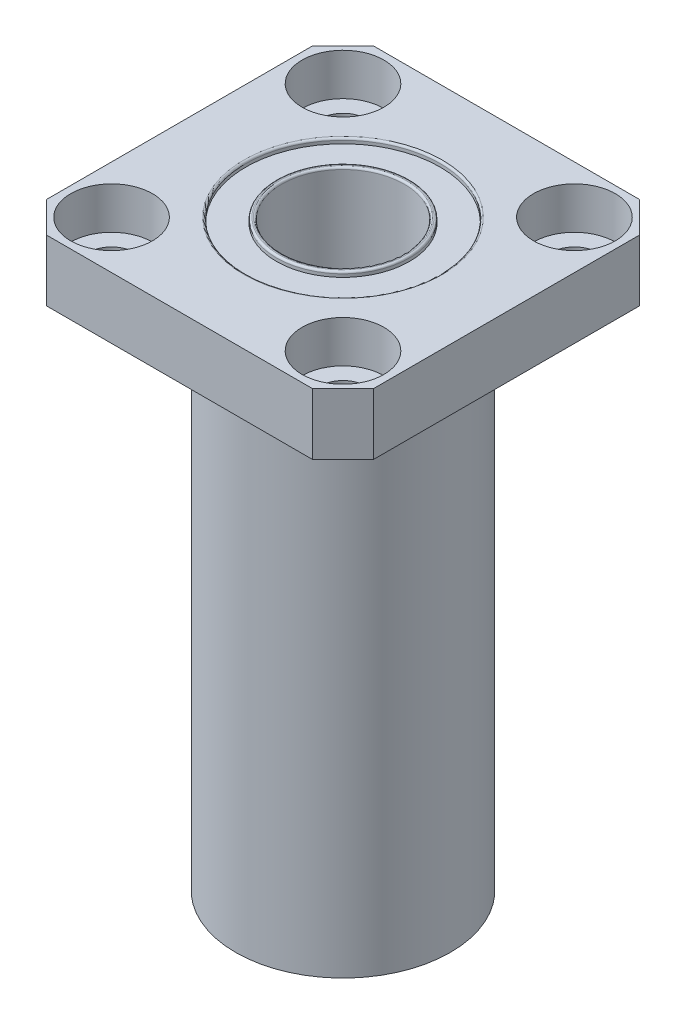
ISO-10303-21;
HEADER;
FILE_DESCRIPTION(('STEP AP214'),'2;1');
FILE_NAME('part.step','',(''),(''),'','','');
FILE_SCHEMA(('AUTOMOTIVE_DESIGN { 1 0 10303 214 1 1 1 1 }'));
ENDSEC;
DATA;
#1=APPLICATION_CONTEXT('core data for automotive mechanical design processes');
#2=APPLICATION_PROTOCOL_DEFINITION('international standard','automotive_design',2000,#1);
#3=PRODUCT_CONTEXT('',#1,'mechanical');
#4=PRODUCT('Part','Part','',(#3));
#5=PRODUCT_RELATED_PRODUCT_CATEGORY('part','',(#4));
#6=PRODUCT_DEFINITION_FORMATION('','',#4);
#7=PRODUCT_DEFINITION_CONTEXT('part definition',#1,'design');
#8=PRODUCT_DEFINITION('design','',#6,#7);
#9=PRODUCT_DEFINITION_SHAPE('','',#8);
#10=(LENGTH_UNIT() NAMED_UNIT(*) SI_UNIT(.MILLI.,.METRE.));
#11=(NAMED_UNIT(*) PLANE_ANGLE_UNIT() SI_UNIT($,.RADIAN.));
#12=(NAMED_UNIT(*) SI_UNIT($,.STERADIAN.) SOLID_ANGLE_UNIT());
#13=UNCERTAINTY_MEASURE_WITH_UNIT(LENGTH_MEASURE(1.E-05),#10,'distance_accuracy_value','');
#14=(GEOMETRIC_REPRESENTATION_CONTEXT(3) GLOBAL_UNCERTAINTY_ASSIGNED_CONTEXT((#13)) GLOBAL_UNIT_ASSIGNED_CONTEXT((#10,
#11,#12)) REPRESENTATION_CONTEXT('',''));
#15=CARTESIAN_POINT('',(0.,0.,0.));
#16=DIRECTION('',(0.,0.,1.));
#17=DIRECTION('',(1.,0.,0.));
#18=AXIS2_PLACEMENT_3D('',#15,#16,#17);
#19=CARTESIAN_POINT('',(0.,57.,0.));
#20=DIRECTION('',(0.,1.,0.));
#21=DIRECTION('',(0.,0.,1.));
#22=AXIS2_PLACEMENT_3D('',#19,#20,#21);
#23=PLANE('',#22);
#24=CARTESIAN_POINT('',(0.,57.,0.));
#25=DIRECTION('',(0.,1.,0.));
#26=DIRECTION('',(0.,0.,1.));
#27=AXIS2_PLACEMENT_3D('',#24,#25,#26);
#28=CIRCLE('',#27,6.2);
#29=CARTESIAN_POINT('',(0.,57.,6.2));
#30=VERTEX_POINT('',#29);
#31=EDGE_CURVE('E47',#30,#30,#28,.F.);
#32=ORIENTED_EDGE('',*,*,#31,.T.);
#33=EDGE_LOOP('',(#32));
#34=FACE_BOUND('',#33,.T.);
#35=CARTESIAN_POINT('',(0.,57.,0.));
#36=DIRECTION('',(0.,1.,0.));
#37=DIRECTION('',(0.,0.,1.));
#38=AXIS2_PLACEMENT_3D('',#35,#36,#37);
#39=CIRCLE('',#38,6.3);
#40=CARTESIAN_POINT('',(0.,57.,6.3));
#41=VERTEX_POINT('',#40);
#42=EDGE_CURVE('E192',#41,#41,#39,.T.);
#43=ORIENTED_EDGE('',*,*,#42,.T.);
#44=EDGE_LOOP('',(#43));
#45=FACE_BOUND('',#44,.T.);
#46=ADVANCED_FACE('F39',(#34,#45),#23,.T.);
#47=CARTESIAN_POINT('',(0.,0.,0.));
#48=DIRECTION('',(0.,1.,0.));
#49=DIRECTION('',(0.,0.,1.));
#50=AXIS2_PLACEMENT_3D('',#47,#48,#49);
#51=PLANE('',#50);
#52=CARTESIAN_POINT('',(0.,0.,0.));
#53=DIRECTION('',(0.,1.,0.));
#54=DIRECTION('',(0.,0.,1.));
#55=AXIS2_PLACEMENT_3D('',#52,#53,#54);
#56=CIRCLE('',#55,6.3);
#57=CARTESIAN_POINT('',(0.,0.,6.3));
#58=VERTEX_POINT('',#57);
#59=EDGE_CURVE('E180',#58,#58,#56,.F.);
#60=ORIENTED_EDGE('',*,*,#59,.T.);
#61=EDGE_LOOP('',(#60));
#62=FACE_BOUND('',#61,.T.);
#63=CARTESIAN_POINT('',(0.,0.,0.));
#64=DIRECTION('',(0.,1.,0.));
#65=DIRECTION('',(0.,0.,1.));
#66=AXIS2_PLACEMENT_3D('',#63,#64,#65);
#67=CIRCLE('',#66,6.2);
#68=CARTESIAN_POINT('',(0.,0.,6.2));
#69=VERTEX_POINT('',#68);
#70=EDGE_CURVE('E177',#69,#69,#67,.T.);
#71=ORIENTED_EDGE('',*,*,#70,.T.);
#72=EDGE_LOOP('',(#71));
#73=FACE_BOUND('',#72,.T.);
#74=ADVANCED_FACE('F224',(#62,#73),#51,.F.);
#75=CARTESIAN_POINT('',(0.,57.,0.));
#76=DIRECTION('',(0.,1.,0.));
#77=DIRECTION('',(0.,0.,1.));
#78=AXIS2_PLACEMENT_3D('',#75,#76,#77);
#79=CIRCLE('',#78,9.7);
#80=CARTESIAN_POINT('',(0.,57.,9.7));
#81=VERTEX_POINT('',#80);
#82=EDGE_CURVE('E165',#81,#81,#79,.F.);
#83=ORIENTED_EDGE('',*,*,#82,.T.);
#84=EDGE_LOOP('',(#83));
#85=FACE_BOUND('',#84,.T.);
#86=CARTESIAN_POINT('',(-11.3137084989848,57.,-11.3137084989848));
#87=DIRECTION('',(0.,1.,0.));
#88=DIRECTION('',(0.,0.,1.));
#89=AXIS2_PLACEMENT_3D('',#86,#87,#88);
#90=CIRCLE('',#89,4.);
#91=CARTESIAN_POINT('',(-11.3137084989848,57.,-7.31370849898476));
#92=VERTEX_POINT('',#91);
#93=EDGE_CURVE('E241',#92,#92,#90,.T.);
#94=ORIENTED_EDGE('',*,*,#93,.F.);
#95=EDGE_LOOP('',(#94));
#96=FACE_BOUND('',#95,.T.);
#97=CARTESIAN_POINT('',(11.3137084989848,57.,-11.3137084989848));
#98=DIRECTION('',(0.,1.,0.));
#99=DIRECTION('',(0.,0.,1.));
#100=AXIS2_PLACEMENT_3D('',#97,#98,#99);
#101=CIRCLE('',#100,4.);
#102=CARTESIAN_POINT('',(11.3137084989848,57.,-7.31370849898476));
#103=VERTEX_POINT('',#102);
#104=EDGE_CURVE('E245',#103,#103,#101,.T.);
#105=ORIENTED_EDGE('',*,*,#104,.F.);
#106=EDGE_LOOP('',(#105));
#107=FACE_BOUND('',#106,.T.);
#108=CARTESIAN_POINT('',(11.3137084989848,57.,11.3137084989848));
#109=DIRECTION('',(0.,1.,0.));
#110=DIRECTION('',(0.,0.,1.));
#111=AXIS2_PLACEMENT_3D('',#108,#109,#110);
#112=CIRCLE('',#111,4.);
#113=CARTESIAN_POINT('',(11.3137084989848,57.,15.3137084989848));
#114=VERTEX_POINT('',#113);
#115=EDGE_CURVE('E249',#114,#114,#112,.T.);
#116=ORIENTED_EDGE('',*,*,#115,.F.);
#117=EDGE_LOOP('',(#116));
#118=FACE_BOUND('',#117,.T.);
#119=CARTESIAN_POINT('',(-11.3137084989848,57.,11.3137084989848));
#120=DIRECTION('',(0.,1.,0.));
#121=DIRECTION('',(0.,0.,1.));
#122=AXIS2_PLACEMENT_3D('',#119,#120,#121);
#123=CIRCLE('',#122,4.);
#124=CARTESIAN_POINT('',(-11.3137084989848,57.,15.3137084989848));
#125=VERTEX_POINT('',#124);
#126=EDGE_CURVE('E252',#125,#125,#123,.T.);
#127=ORIENTED_EDGE('',*,*,#126,.F.);
#128=EDGE_LOOP('',(#127));
#129=FACE_BOUND('',#128,.T.);
#130=DIRECTION('',(-1.,0.,0.));
#131=VECTOR('',#130,1.);
#132=CARTESIAN_POINT('',(16.,57.,-16.));
#133=LINE('',#132,#131);
#134=CARTESIAN_POINT('',(13.,57.,-16.));
#135=VERTEX_POINT('',#134);
#136=CARTESIAN_POINT('',(-13.,57.,-16.));
#137=VERTEX_POINT('',#136);
#138=EDGE_CURVE('E109',#135,#137,#133,.T.);
#139=ORIENTED_EDGE('',*,*,#138,.T.);
#140=DIRECTION('',(0.707106781186547,0.,-0.707106781186548));
#141=VECTOR('',#140,1.);
#142=CARTESIAN_POINT('',(-14.5,57.,-14.5));
#143=LINE('',#142,#141);
#144=CARTESIAN_POINT('',(-16.,57.,-13.));
#145=VERTEX_POINT('',#144);
#146=EDGE_CURVE('E144',#137,#145,#143,.F.);
#147=ORIENTED_EDGE('',*,*,#146,.T.);
#148=DIRECTION('',(0.,0.,1.));
#149=VECTOR('',#148,1.);
#150=CARTESIAN_POINT('',(-16.,57.,-16.));
#151=LINE('',#150,#149);
#152=CARTESIAN_POINT('',(-16.,57.,13.));
#153=VERTEX_POINT('',#152);
#154=EDGE_CURVE('E278',#145,#153,#151,.T.);
#155=ORIENTED_EDGE('',*,*,#154,.T.);
#156=DIRECTION('',(-0.707106781186548,0.,-0.707106781186547));
#157=VECTOR('',#156,1.);
#158=CARTESIAN_POINT('',(-14.5,57.,14.5));
#159=LINE('',#158,#157);
#160=CARTESIAN_POINT('',(-13.,57.,16.));
#161=VERTEX_POINT('',#160);
#162=EDGE_CURVE('E116',#153,#161,#159,.F.);
#163=ORIENTED_EDGE('',*,*,#162,.T.);
#164=DIRECTION('',(1.,0.,0.));
#165=VECTOR('',#164,1.);
#166=CARTESIAN_POINT('',(16.,57.,16.));
#167=LINE('',#166,#165);
#168=CARTESIAN_POINT('',(13.,57.,16.));
#169=VERTEX_POINT('',#168);
#170=EDGE_CURVE('E281',#161,#169,#167,.T.);
#171=ORIENTED_EDGE('',*,*,#170,.T.);
#172=DIRECTION('',(-0.707106781186547,0.,0.707106781186548));
#173=VECTOR('',#172,1.);
#174=CARTESIAN_POINT('',(14.5,57.,14.5));
#175=LINE('',#174,#173);
#176=CARTESIAN_POINT('',(16.,57.,13.));
#177=VERTEX_POINT('',#176);
#178=EDGE_CURVE('E117',#169,#177,#175,.F.);
#179=ORIENTED_EDGE('',*,*,#178,.T.);
#180=DIRECTION('',(0.,0.,-1.));
#181=VECTOR('',#180,1.);
#182=CARTESIAN_POINT('',(16.,57.,-16.));
#183=LINE('',#182,#181);
#184=CARTESIAN_POINT('',(16.,57.,-13.));
#185=VERTEX_POINT('',#184);
#186=EDGE_CURVE('E111',#177,#185,#183,.T.);
#187=ORIENTED_EDGE('',*,*,#186,.T.);
#188=DIRECTION('',(0.707106781186548,0.,0.707106781186547));
#189=VECTOR('',#188,1.);
#190=CARTESIAN_POINT('',(14.5,57.,-14.5));
#191=LINE('',#190,#189);
#192=EDGE_CURVE('E106',#185,#135,#191,.F.);
#193=ORIENTED_EDGE('',*,*,#192,.T.);
#194=EDGE_LOOP('',(#139,#147,#155,#163,#171,#179,#187,#193));
#195=FACE_BOUND('',#194,.T.);
#196=ADVANCED_FACE('F108',(#85,#96,#107,#118,#129,#195),#23,.T.);
#197=CARTESIAN_POINT('',(0.,0.,0.));
#198=DIRECTION('',(0.,1.,0.));
#199=DIRECTION('',(0.,0.,1.));
#200=AXIS2_PLACEMENT_3D('',#197,#198,#199);
#201=CIRCLE('',#200,9.7);
#202=CARTESIAN_POINT('',(0.,0.,9.7));
#203=VERTEX_POINT('',#202);
#204=EDGE_CURVE('E174',#203,#203,#201,.T.);
#205=ORIENTED_EDGE('',*,*,#204,.T.);
#206=EDGE_LOOP('',(#205));
#207=FACE_BOUND('',#206,.T.);
#208=CARTESIAN_POINT('',(0.,0.,0.));
#209=DIRECTION('',(0.,1.,0.));
#210=DIRECTION('',(0.,0.,1.));
#211=AXIS2_PLACEMENT_3D('',#208,#209,#210);
#212=CIRCLE('',#211,10.5);
#213=CARTESIAN_POINT('',(0.,0.,-10.5));
#214=VERTEX_POINT('',#213);
#215=EDGE_CURVE('E132',#214,#214,#212,.T.);
#216=ORIENTED_EDGE('',*,*,#215,.F.);
#217=EDGE_LOOP('',(#216));
#218=FACE_BOUND('',#217,.T.);
#219=ADVANCED_FACE('F218',(#207,#218),#51,.F.);
#220=CARTESIAN_POINT('',(0.,57.,0.));
#221=DIRECTION('',(0.,-1.,0.));
#222=DIRECTION('',(0.,0.,-1.));
#223=AXIS2_PLACEMENT_3D('',#220,#221,#222);
#224=CYLINDRICAL_SURFACE('',#223,10.5);
#225=CARTESIAN_POINT('',(0.,51.,0.));
#226=DIRECTION('',(0.,-1.,0.));
#227=DIRECTION('',(0.,0.,-1.));
#228=AXIS2_PLACEMENT_3D('',#225,#226,#227);
#229=CIRCLE('',#228,10.5);
#230=CARTESIAN_POINT('',(0.,51.,-10.5));
#231=VERTEX_POINT('',#230);
#232=EDGE_CURVE('E136',#231,#231,#229,.T.);
#233=CARTESIAN_POINT('',(0.,51.,-10.5));
#234=CARTESIAN_POINT('',(0.,50.46875,-10.5));
#235=CARTESIAN_POINT('',(0.,49.9375,-10.5));
#236=CARTESIAN_POINT('',(0.,48.875,-10.5));
#237=CARTESIAN_POINT('',(0.,48.34375,-10.5));
#238=CARTESIAN_POINT('',(0.,47.28125,-10.5));
#239=CARTESIAN_POINT('',(0.,46.75,-10.5));
#240=CARTESIAN_POINT('',(0.,45.6875,-10.5));
#241=CARTESIAN_POINT('',(0.,45.15625,-10.5));
#242=CARTESIAN_POINT('',(0.,44.09375,-10.5));
#243=CARTESIAN_POINT('',(0.,43.5625,-10.5));
#244=CARTESIAN_POINT('',(0.,42.5,-10.5));
#245=CARTESIAN_POINT('',(0.,41.96875,-10.5));
#246=CARTESIAN_POINT('',(0.,40.90625,-10.5));
#247=CARTESIAN_POINT('',(0.,40.375,-10.5));
#248=CARTESIAN_POINT('',(0.,39.3125,-10.5));
#249=CARTESIAN_POINT('',(0.,38.78125,-10.5));
#250=CARTESIAN_POINT('',(0.,37.71875,-10.5));
#251=CARTESIAN_POINT('',(0.,37.1875,-10.5));
#252=CARTESIAN_POINT('',(0.,36.125,-10.5));
#253=CARTESIAN_POINT('',(0.,35.59375,-10.5));
#254=CARTESIAN_POINT('',(0.,34.53125,-10.5));
#255=CARTESIAN_POINT('',(0.,34.,-10.5));
#256=CARTESIAN_POINT('',(0.,32.9375,-10.5));
#257=CARTESIAN_POINT('',(0.,32.40625,-10.5));
#258=CARTESIAN_POINT('',(0.,31.34375,-10.5));
#259=CARTESIAN_POINT('',(0.,30.8125,-10.5));
#260=CARTESIAN_POINT('',(0.,29.75,-10.5));
#261=CARTESIAN_POINT('',(0.,29.21875,-10.5));
#262=CARTESIAN_POINT('',(0.,28.15625,-10.5));
#263=CARTESIAN_POINT('',(0.,27.625,-10.5));
#264=CARTESIAN_POINT('',(0.,26.5625,-10.5));
#265=CARTESIAN_POINT('',(0.,26.03125,-10.5));
#266=CARTESIAN_POINT('',(0.,24.96875,-10.5));
#267=CARTESIAN_POINT('',(0.,24.4375,-10.5));
#268=CARTESIAN_POINT('',(0.,23.375,-10.5));
#269=CARTESIAN_POINT('',(0.,22.84375,-10.5));
#270=CARTESIAN_POINT('',(0.,21.78125,-10.5));
#271=CARTESIAN_POINT('',(0.,21.25,-10.5));
#272=CARTESIAN_POINT('',(0.,20.1875,-10.5));
#273=CARTESIAN_POINT('',(0.,19.65625,-10.5));
#274=CARTESIAN_POINT('',(0.,18.59375,-10.5));
#275=CARTESIAN_POINT('',(0.,18.0625,-10.5));
#276=CARTESIAN_POINT('',(0.,17.,-10.5));
#277=CARTESIAN_POINT('',(0.,16.46875,-10.5));
#278=CARTESIAN_POINT('',(0.,15.40625,-10.5));
#279=CARTESIAN_POINT('',(0.,14.875,-10.5));
#280=CARTESIAN_POINT('',(0.,13.8125,-10.5));
#281=CARTESIAN_POINT('',(0.,13.28125,-10.5));
#282=CARTESIAN_POINT('',(0.,12.21875,-10.5));
#283=CARTESIAN_POINT('',(0.,11.6875,-10.5));
#284=CARTESIAN_POINT('',(0.,10.625,-10.5));
#285=CARTESIAN_POINT('',(0.,10.09375,-10.5));
#286=CARTESIAN_POINT('',(0.,9.03125,-10.5));
#287=CARTESIAN_POINT('',(0.,8.5,-10.5));
#288=CARTESIAN_POINT('',(0.,7.4375,-10.5));
#289=CARTESIAN_POINT('',(0.,6.90625,-10.5));
#290=CARTESIAN_POINT('',(0.,5.84375,-10.5));
#291=CARTESIAN_POINT('',(0.,5.3125,-10.5));
#292=CARTESIAN_POINT('',(0.,4.25,-10.5));
#293=CARTESIAN_POINT('',(0.,3.71875,-10.5));
#294=CARTESIAN_POINT('',(0.,2.65625,-10.5));
#295=CARTESIAN_POINT('',(0.,2.125,-10.5));
#296=CARTESIAN_POINT('',(0.,1.0625,-10.5));
#297=CARTESIAN_POINT('',(0.,0.531249999999995,-10.5));
#298=CARTESIAN_POINT('',(0.,0.,-10.5));
#299=B_SPLINE_CURVE_WITH_KNOTS('',3,(#233,#234,#235,#236,#237,#238,#239,#240,#241,#242,#243,
#244,#245,#246,#247,#248,#249,#250,#251,#252,#253,#254,#255,#256,#257,#258,#259,#260,#261,#262,
#263,#264,#265,#266,#267,#268,#269,#270,#271,#272,#273,#274,#275,#276,#277,#278,#279,#280,#281,
#282,#283,#284,#285,#286,#287,#288,#289,#290,#291,#292,#293,#294,#295,#296,#297,#298),
.UNSPECIFIED.,.F.,.F.,(4,2,2,2,2,2,2,2,2,2,2,2,2,2,2,2,2,2,2,2,2,2,2,2,2,2,2,2,2,2,2,2,4),(0.,
1.59375,3.1875,4.78125,6.37500000000001,7.96875,9.56250000000001,11.15625,12.75,14.34375,
15.9375,17.53125,19.125,20.71875,22.3125,23.90625,25.5,27.09375,28.6875,30.28125,31.875,
33.46875,35.0625,36.65625,38.25,39.84375,41.4375,43.03125,44.625,46.21875,47.8125,49.40625,51.),.UNSPECIFIED.);
#300=EDGE_CURVE('BSEAM208',#231,#214,#299,.T.);
#301=ORIENTED_EDGE('',*,*,#232,.T.);
#302=ORIENTED_EDGE('',*,*,#215,.T.);
#303=ORIENTED_EDGE('',*,*,#300,.T.);
#304=ORIENTED_EDGE('',*,*,#300,.F.);
#305=EDGE_LOOP('',(#301,#303,#302,#304));
#306=FACE_BOUND('',#305,.T.);
#307=ADVANCED_FACE('F208',(#306),#224,.T.);
#308=CARTESIAN_POINT('',(0.,57.,0.));
#309=DIRECTION('',(0.,-1.,0.));
#310=DIRECTION('',(0.,0.,-1.));
#311=AXIS2_PLACEMENT_3D('',#308,#309,#310);
#312=CYLINDRICAL_SURFACE('',#311,6.);
#313=CARTESIAN_POINT('',(0.,0.199999999999999,0.));
#314=DIRECTION('',(0.,1.,0.));
#315=DIRECTION('',(0.,0.,1.));
#316=AXIS2_PLACEMENT_3D('',#313,#314,#315);
#317=CIRCLE('',#316,6.);
#318=CARTESIAN_POINT('',(0.,0.199999999999999,-6.));
#319=VERTEX_POINT('',#318);
#320=EDGE_CURVE('E189',#319,#319,#317,.F.);
#321=CARTESIAN_POINT('',(0.,56.8,0.));
#322=DIRECTION('',(0.,1.,0.));
#323=DIRECTION('',(0.,0.,1.));
#324=AXIS2_PLACEMENT_3D('',#321,#322,#323);
#325=CIRCLE('',#324,6.);
#326=CARTESIAN_POINT('',(0.,56.8,-6.));
#327=VERTEX_POINT('',#326);
#328=EDGE_CURVE('E186',#327,#327,#325,.T.);
#329=CARTESIAN_POINT('',(0.,0.199999999999999,-6.));
#330=CARTESIAN_POINT('',(0.,0.789583333333332,-6.));
#331=CARTESIAN_POINT('',(0.,1.37916666666667,-6.));
#332=CARTESIAN_POINT('',(0.,2.55833333333333,-6.));
#333=CARTESIAN_POINT('',(0.,3.14791666666666,-6.));
#334=CARTESIAN_POINT('',(0.,4.32708333333333,-6.));
#335=CARTESIAN_POINT('',(0.,4.91666666666667,-6.));
#336=CARTESIAN_POINT('',(0.,6.09583333333334,-6.));
#337=CARTESIAN_POINT('',(0.,6.68541666666667,-6.));
#338=CARTESIAN_POINT('',(0.,7.86458333333334,-6.));
#339=CARTESIAN_POINT('',(0.,8.45416666666667,-6.));
#340=CARTESIAN_POINT('',(0.,9.63333333333334,-6.));
#341=CARTESIAN_POINT('',(0.,10.2229166666667,-6.));
#342=CARTESIAN_POINT('',(0.,11.4020833333333,-6.));
#343=CARTESIAN_POINT('',(0.,11.9916666666667,-6.));
#344=CARTESIAN_POINT('',(0.,13.1708333333333,-6.));
#345=CARTESIAN_POINT('',(0.,13.7604166666667,-6.));
#346=CARTESIAN_POINT('',(0.,14.9395833333333,-6.));
#347=CARTESIAN_POINT('',(0.,15.5291666666667,-6.));
#348=CARTESIAN_POINT('',(0.,16.7083333333333,-6.));
#349=CARTESIAN_POINT('',(0.,17.2979166666667,-6.));
#350=CARTESIAN_POINT('',(0.,18.4770833333333,-6.));
#351=CARTESIAN_POINT('',(0.,19.0666666666667,-6.));
#352=CARTESIAN_POINT('',(0.,20.2458333333333,-6.));
#353=CARTESIAN_POINT('',(0.,20.8354166666667,-6.));
#354=CARTESIAN_POINT('',(0.,22.0145833333333,-6.));
#355=CARTESIAN_POINT('',(0.,22.6041666666667,-6.));
#356=CARTESIAN_POINT('',(0.,23.7833333333333,-6.));
#357=CARTESIAN_POINT('',(0.,24.3729166666667,-6.));
#358=CARTESIAN_POINT('',(0.,25.5520833333333,-6.));
#359=CARTESIAN_POINT('',(0.,26.1416666666667,-6.));
#360=CARTESIAN_POINT('',(0.,27.3208333333334,-6.));
#361=CARTESIAN_POINT('',(0.,27.9104166666667,-6.));
#362=CARTESIAN_POINT('',(0.,29.0895833333333,-6.));
#363=CARTESIAN_POINT('',(0.,29.6791666666667,-6.));
#364=CARTESIAN_POINT('',(0.,30.8583333333333,-6.));
#365=CARTESIAN_POINT('',(0.,31.4479166666667,-6.));
#366=CARTESIAN_POINT('',(0.,32.6270833333333,-6.));
#367=CARTESIAN_POINT('',(0.,33.2166666666667,-6.));
#368=CARTESIAN_POINT('',(0.,34.3958333333334,-6.));
#369=CARTESIAN_POINT('',(0.,34.9854166666667,-6.));
#370=CARTESIAN_POINT('',(0.,36.1645833333334,-6.));
#371=CARTESIAN_POINT('',(0.,36.7541666666667,-6.));
#372=CARTESIAN_POINT('',(0.,37.9333333333334,-6.));
#373=CARTESIAN_POINT('',(0.,38.5229166666667,-6.));
#374=CARTESIAN_POINT('',(0.,39.7020833333334,-6.));
#375=CARTESIAN_POINT('',(0.,40.2916666666667,-6.));
#376=CARTESIAN_POINT('',(0.,41.4708333333334,-6.));
#377=CARTESIAN_POINT('',(0.,42.0604166666667,-6.));
#378=CARTESIAN_POINT('',(0.,43.2395833333333,-6.));
#379=CARTESIAN_POINT('',(0.,43.8291666666667,-6.));
#380=CARTESIAN_POINT('',(0.,45.0083333333334,-6.));
#381=CARTESIAN_POINT('',(0.,45.5979166666667,-6.));
#382=CARTESIAN_POINT('',(0.,46.7770833333334,-6.));
#383=CARTESIAN_POINT('',(0.,47.3666666666667,-6.));
#384=CARTESIAN_POINT('',(0.,48.5458333333334,-6.));
#385=CARTESIAN_POINT('',(0.,49.1354166666667,-6.));
#386=CARTESIAN_POINT('',(0.,50.3145833333334,-6.));
#387=CARTESIAN_POINT('',(0.,50.9041666666667,-6.));
#388=CARTESIAN_POINT('',(0.,52.0833333333334,-6.));
#389=CARTESIAN_POINT('',(0.,52.6729166666667,-6.));
#390=CARTESIAN_POINT('',(0.,53.8520833333334,-6.));
#391=CARTESIAN_POINT('',(0.,54.4416666666667,-6.));
#392=CARTESIAN_POINT('',(0.,55.6208333333334,-6.));
#393=CARTESIAN_POINT('',(0.,56.2104166666667,-6.));
#394=CARTESIAN_POINT('',(0.,56.8,-6.));
#395=B_SPLINE_CURVE_WITH_KNOTS('',3,(#329,#330,#331,#332,#333,#334,#335,#336,#337,#338,#339,
#340,#341,#342,#343,#344,#345,#346,#347,#348,#349,#350,#351,#352,#353,#354,#355,#356,#357,#358,
#359,#360,#361,#362,#363,#364,#365,#366,#367,#368,#369,#370,#371,#372,#373,#374,#375,#376,#377,
#378,#379,#380,#381,#382,#383,#384,#385,#386,#387,#388,#389,#390,#391,#392,#393,#394),
.UNSPECIFIED.,.F.,.F.,(4,2,2,2,2,2,2,2,2,2,2,2,2,2,2,2,2,2,2,2,2,2,2,2,2,2,2,2,2,2,2,2,4),(0.,
1.76875,3.5375,5.30625000000001,7.075,8.84375,10.6125,12.38125,14.15,15.91875,17.6875,19.45625,
21.225,22.99375,24.7625,26.53125,28.3,30.06875,31.8375,33.60625,35.375,37.14375,38.9125,
40.68125,42.45,44.21875,45.9875,47.75625,49.525,51.29375,53.0625,54.83125,56.6),.UNSPECIFIED.);
#396=EDGE_CURVE('BSEAM205',#319,#327,#395,.T.);
#397=ORIENTED_EDGE('',*,*,#320,.T.);
#398=ORIENTED_EDGE('',*,*,#328,.T.);
#399=ORIENTED_EDGE('',*,*,#396,.T.);
#400=ORIENTED_EDGE('',*,*,#396,.F.);
#401=EDGE_LOOP('',(#397,#399,#398,#400));
#402=FACE_BOUND('',#401,.T.);
#403=ADVANCED_FACE('F205',(#402),#312,.F.);
#404=CARTESIAN_POINT('',(0.,51.,0.));
#405=DIRECTION('',(0.,-1.,0.));
#406=DIRECTION('',(0.,0.,-1.));
#407=AXIS2_PLACEMENT_3D('',#404,#405,#406);
#408=PLANE('',#407);
#409=CARTESIAN_POINT('',(-11.3137084989848,51.,-11.3137084989848));
#410=DIRECTION('',(0.,-1.,0.));
#411=DIRECTION('',(0.,0.,-1.));
#412=AXIS2_PLACEMENT_3D('',#409,#410,#411);
#413=CIRCLE('',#412,2.25);
#414=CARTESIAN_POINT('',(-11.3137084989848,51.,-13.5637084989848));
#415=VERTEX_POINT('',#414);
#416=EDGE_CURVE('E139',#415,#415,#413,.T.);
#417=ORIENTED_EDGE('',*,*,#416,.F.);
#418=EDGE_LOOP('',(#417));
#419=FACE_BOUND('',#418,.T.);
#420=CARTESIAN_POINT('',(11.3137084989848,51.,-11.3137084989848));
#421=DIRECTION('',(0.,-1.,0.));
#422=DIRECTION('',(0.,0.,-1.));
#423=AXIS2_PLACEMENT_3D('',#420,#421,#422);
#424=CIRCLE('',#423,2.25);
#425=CARTESIAN_POINT('',(11.3137084989848,51.,-13.5637084989848));
#426=VERTEX_POINT('',#425);
#427=EDGE_CURVE('E288',#426,#426,#424,.T.);
#428=ORIENTED_EDGE('',*,*,#427,.F.);
#429=EDGE_LOOP('',(#428));
#430=FACE_BOUND('',#429,.T.);
#431=CARTESIAN_POINT('',(11.3137084989848,51.,11.3137084989848));
#432=DIRECTION('',(0.,-1.,0.));
#433=DIRECTION('',(0.,0.,-1.));
#434=AXIS2_PLACEMENT_3D('',#431,#432,#433);
#435=CIRCLE('',#434,2.25);
#436=CARTESIAN_POINT('',(11.3137084989848,51.,9.06370849898476));
#437=VERTEX_POINT('',#436);
#438=EDGE_CURVE('E255',#437,#437,#435,.T.);
#439=ORIENTED_EDGE('',*,*,#438,.F.);
#440=EDGE_LOOP('',(#439));
#441=FACE_BOUND('',#440,.T.);
#442=CARTESIAN_POINT('',(-11.3137084989848,51.,11.3137084989848));
#443=DIRECTION('',(0.,-1.,0.));
#444=DIRECTION('',(0.,0.,-1.));
#445=AXIS2_PLACEMENT_3D('',#442,#443,#444);
#446=CIRCLE('',#445,2.25);
#447=CARTESIAN_POINT('',(-11.3137084989848,51.,9.06370849898477));
#448=VERTEX_POINT('',#447);
#449=EDGE_CURVE('E268',#448,#448,#446,.T.);
#450=ORIENTED_EDGE('',*,*,#449,.F.);
#451=EDGE_LOOP('',(#450));
#452=FACE_BOUND('',#451,.T.);
#453=DIRECTION('',(0.,0.,1.));
#454=VECTOR('',#453,1.);
#455=CARTESIAN_POINT('',(-16.,51.,-16.));
#456=LINE('',#455,#454);
#457=CARTESIAN_POINT('',(-16.,51.,-13.));
#458=VERTEX_POINT('',#457);
#459=CARTESIAN_POINT('',(-16.,51.,13.));
#460=VERTEX_POINT('',#459);
#461=EDGE_CURVE('E127',#458,#460,#456,.T.);
#462=ORIENTED_EDGE('',*,*,#461,.F.);
#463=DIRECTION('',(-0.707106781186547,0.,0.707106781186548));
#464=VECTOR('',#463,1.);
#465=CARTESIAN_POINT('',(-14.5,51.,-14.5));
#466=LINE('',#465,#464);
#467=CARTESIAN_POINT('',(-13.,51.,-16.));
#468=VERTEX_POINT('',#467);
#469=EDGE_CURVE('E155',#458,#468,#466,.F.);
#470=ORIENTED_EDGE('',*,*,#469,.T.);
#471=DIRECTION('',(-1.,0.,0.));
#472=VECTOR('',#471,1.);
#473=CARTESIAN_POINT('',(16.,51.,-16.));
#474=LINE('',#473,#472);
#475=CARTESIAN_POINT('',(13.,51.,-16.));
#476=VERTEX_POINT('',#475);
#477=EDGE_CURVE('E276',#476,#468,#474,.T.);
#478=ORIENTED_EDGE('',*,*,#477,.F.);
#479=DIRECTION('',(-0.707106781186548,0.,-0.707106781186547));
#480=VECTOR('',#479,1.);
#481=CARTESIAN_POINT('',(14.5,51.,-14.5));
#482=LINE('',#481,#480);
#483=CARTESIAN_POINT('',(16.,51.,-13.));
#484=VERTEX_POINT('',#483);
#485=EDGE_CURVE('E131',#476,#484,#482,.F.);
#486=ORIENTED_EDGE('',*,*,#485,.T.);
#487=DIRECTION('',(0.,0.,-1.));
#488=VECTOR('',#487,1.);
#489=CARTESIAN_POINT('',(16.,51.,-16.));
#490=LINE('',#489,#488);
#491=CARTESIAN_POINT('',(16.,51.,13.));
#492=VERTEX_POINT('',#491);
#493=EDGE_CURVE('E273',#492,#484,#490,.T.);
#494=ORIENTED_EDGE('',*,*,#493,.F.);
#495=DIRECTION('',(0.707106781186547,0.,-0.707106781186548));
#496=VECTOR('',#495,1.);
#497=CARTESIAN_POINT('',(14.5,51.,14.5));
#498=LINE('',#497,#496);
#499=CARTESIAN_POINT('',(13.,51.,16.));
#500=VERTEX_POINT('',#499);
#501=EDGE_CURVE('E54',#492,#500,#498,.F.);
#502=ORIENTED_EDGE('',*,*,#501,.T.);
#503=DIRECTION('',(1.,0.,0.));
#504=VECTOR('',#503,1.);
#505=CARTESIAN_POINT('',(16.,51.,16.));
#506=LINE('',#505,#504);
#507=CARTESIAN_POINT('',(-13.,51.,16.));
#508=VERTEX_POINT('',#507);
#509=EDGE_CURVE('E271',#508,#500,#506,.T.);
#510=ORIENTED_EDGE('',*,*,#509,.F.);
#511=DIRECTION('',(0.707106781186548,0.,0.707106781186547));
#512=VECTOR('',#511,1.);
#513=CARTESIAN_POINT('',(-14.5,51.,14.5));
#514=LINE('',#513,#512);
#515=EDGE_CURVE('E153',#508,#460,#514,.F.);
#516=ORIENTED_EDGE('',*,*,#515,.T.);
#517=EDGE_LOOP('',(#462,#470,#478,#486,#494,#502,#510,#516));
#518=FACE_BOUND('',#517,.T.);
#519=ORIENTED_EDGE('',*,*,#232,.F.);
#520=EDGE_LOOP('',(#519));
#521=FACE_BOUND('',#520,.T.);
#522=ADVANCED_FACE('F207',(#419,#430,#441,#452,#518,#521),#408,.T.);
#523=CARTESIAN_POINT('',(-16.,51.,-16.));
#524=DIRECTION('',(-1.,0.,0.));
#525=DIRECTION('',(0.,0.,1.));
#526=AXIS2_PLACEMENT_3D('',#523,#524,#525);
#527=PLANE('',#526);
#528=ORIENTED_EDGE('',*,*,#154,.F.);
#529=DIRECTION('',(0.,-1.,0.));
#530=VECTOR('',#529,1.);
#531=CARTESIAN_POINT('',(-16.,51.,-13.));
#532=LINE('',#531,#530);
#533=EDGE_CURVE('E149',#145,#458,#532,.T.);
#534=ORIENTED_EDGE('',*,*,#533,.T.);
#535=ORIENTED_EDGE('',*,*,#461,.T.);
#536=DIRECTION('',(0.,1.,0.));
#537=VECTOR('',#536,1.);
#538=CARTESIAN_POINT('',(-16.,51.,13.));
#539=LINE('',#538,#537);
#540=EDGE_CURVE('E146',#460,#153,#539,.T.);
#541=ORIENTED_EDGE('',*,*,#540,.T.);
#542=EDGE_LOOP('',(#528,#534,#535,#541));
#543=FACE_BOUND('',#542,.T.);
#544=ADVANCED_FACE('F215',(#543),#527,.T.);
#545=CARTESIAN_POINT('',(16.,51.,-16.));
#546=DIRECTION('',(0.,0.,-1.));
#547=DIRECTION('',(-1.,0.,0.));
#548=AXIS2_PLACEMENT_3D('',#545,#546,#547);
#549=PLANE('',#548);
#550=ORIENTED_EDGE('',*,*,#477,.T.);
#551=DIRECTION('',(0.,1.,0.));
#552=VECTOR('',#551,1.);
#553=CARTESIAN_POINT('',(-13.,51.,-16.));
#554=LINE('',#553,#552);
#555=EDGE_CURVE('E126',#468,#137,#554,.T.);
#556=ORIENTED_EDGE('',*,*,#555,.T.);
#557=ORIENTED_EDGE('',*,*,#138,.F.);
#558=DIRECTION('',(0.,-1.,0.));
#559=VECTOR('',#558,1.);
#560=CARTESIAN_POINT('',(13.,51.,-16.));
#561=LINE('',#560,#559);
#562=EDGE_CURVE('E123',#135,#476,#561,.T.);
#563=ORIENTED_EDGE('',*,*,#562,.T.);
#564=EDGE_LOOP('',(#550,#556,#557,#563));
#565=FACE_BOUND('',#564,.T.);
#566=ADVANCED_FACE('F122',(#565),#549,.T.);
#567=CARTESIAN_POINT('',(16.,51.,-16.));
#568=DIRECTION('',(1.,0.,0.));
#569=DIRECTION('',(0.,0.,-1.));
#570=AXIS2_PLACEMENT_3D('',#567,#568,#569);
#571=PLANE('',#570);
#572=ORIENTED_EDGE('',*,*,#493,.T.);
#573=DIRECTION('',(0.,1.,0.));
#574=VECTOR('',#573,1.);
#575=CARTESIAN_POINT('',(16.,51.,-13.));
#576=LINE('',#575,#574);
#577=EDGE_CURVE('E163',#484,#185,#576,.T.);
#578=ORIENTED_EDGE('',*,*,#577,.T.);
#579=ORIENTED_EDGE('',*,*,#186,.F.);
#580=DIRECTION('',(0.,-1.,0.));
#581=VECTOR('',#580,1.);
#582=CARTESIAN_POINT('',(16.,51.,13.));
#583=LINE('',#582,#581);
#584=EDGE_CURVE('E161',#177,#492,#583,.T.);
#585=ORIENTED_EDGE('',*,*,#584,.T.);
#586=EDGE_LOOP('',(#572,#578,#579,#585));
#587=FACE_BOUND('',#586,.T.);
#588=ADVANCED_FACE('F341',(#587),#571,.T.);
#589=CARTESIAN_POINT('',(16.,51.,16.));
#590=DIRECTION('',(0.,0.,1.));
#591=DIRECTION('',(1.,0.,0.));
#592=AXIS2_PLACEMENT_3D('',#589,#590,#591);
#593=PLANE('',#592);
#594=ORIENTED_EDGE('',*,*,#170,.F.);
#595=DIRECTION('',(0.,-1.,0.));
#596=VECTOR('',#595,1.);
#597=CARTESIAN_POINT('',(-13.,51.,16.));
#598=LINE('',#597,#596);
#599=EDGE_CURVE('E61',#161,#508,#598,.T.);
#600=ORIENTED_EDGE('',*,*,#599,.T.);
#601=ORIENTED_EDGE('',*,*,#509,.T.);
#602=DIRECTION('',(0.,1.,0.));
#603=VECTOR('',#602,1.);
#604=CARTESIAN_POINT('',(13.,51.,16.));
#605=LINE('',#604,#603);
#606=EDGE_CURVE('E157',#500,#169,#605,.T.);
#607=ORIENTED_EDGE('',*,*,#606,.T.);
#608=EDGE_LOOP('',(#594,#600,#601,#607));
#609=FACE_BOUND('',#608,.T.);
#610=ADVANCED_FACE('F336',(#609),#593,.T.);
#611=CARTESIAN_POINT('',(-11.3137084989848,57.,11.3137084989848));
#612=DIRECTION('',(0.,1.,0.));
#613=DIRECTION('',(0.,0.,1.));
#614=AXIS2_PLACEMENT_3D('',#611,#612,#613);
#615=CYLINDRICAL_SURFACE('',#614,2.25);
#616=ORIENTED_EDGE('',*,*,#449,.T.);
#617=EDGE_LOOP('',(#616));
#618=FACE_BOUND('',#617,.T.);
#619=CARTESIAN_POINT('',(-11.3137084989848,52.9,11.3137084989848));
#620=DIRECTION('',(0.,1.,0.));
#621=DIRECTION('',(0.,0.,1.));
#622=AXIS2_PLACEMENT_3D('',#619,#620,#621);
#623=CIRCLE('',#622,2.25000000000001);
#624=CARTESIAN_POINT('',(-11.3137084989848,52.9,13.5637084989848));
#625=VERTEX_POINT('',#624);
#626=EDGE_CURVE('E258',#625,#625,#623,.T.);
#627=ORIENTED_EDGE('',*,*,#626,.T.);
#628=EDGE_LOOP('',(#627));
#629=FACE_BOUND('',#628,.T.);
#630=ADVANCED_FACE('F333',(#618,#629),#615,.F.);
#631=CARTESIAN_POINT('',(-9.06370849898475,52.9,11.3137084989848));
#632=DIRECTION('',(0.,-1.,0.));
#633=DIRECTION('',(0.,0.,-1.));
#634=AXIS2_PLACEMENT_3D('',#631,#632,#633);
#635=PLANE('',#634);
#636=ORIENTED_EDGE('',*,*,#626,.F.);
#637=EDGE_LOOP('',(#636));
#638=FACE_BOUND('',#637,.T.);
#639=CARTESIAN_POINT('',(-11.3137084989848,52.9,11.3137084989848));
#640=DIRECTION('',(0.,1.,0.));
#641=DIRECTION('',(0.,0.,1.));
#642=AXIS2_PLACEMENT_3D('',#639,#640,#641);
#643=CIRCLE('',#642,4.);
#644=CARTESIAN_POINT('',(-11.3137084989848,52.9,15.3137084989848));
#645=VERTEX_POINT('',#644);
#646=EDGE_CURVE('E254',#645,#645,#643,.T.);
#647=ORIENTED_EDGE('',*,*,#646,.T.);
#648=EDGE_LOOP('',(#647));
#649=FACE_BOUND('',#648,.T.);
#650=ADVANCED_FACE('F329',(#638,#649),#635,.F.);
#651=CARTESIAN_POINT('',(-11.3137084989848,57.,11.3137084989848));
#652=DIRECTION('',(0.,1.,0.));
#653=DIRECTION('',(0.,0.,1.));
#654=AXIS2_PLACEMENT_3D('',#651,#652,#653);
#655=CYLINDRICAL_SURFACE('',#654,4.);
#656=ORIENTED_EDGE('',*,*,#646,.F.);
#657=EDGE_LOOP('',(#656));
#658=FACE_BOUND('',#657,.T.);
#659=ORIENTED_EDGE('',*,*,#126,.T.);
#660=EDGE_LOOP('',(#659));
#661=FACE_BOUND('',#660,.T.);
#662=ADVANCED_FACE('F322',(#658,#661),#655,.F.);
#663=CARTESIAN_POINT('',(11.3137084989848,57.,11.3137084989848));
#664=DIRECTION('',(0.,1.,0.));
#665=DIRECTION('',(0.,0.,1.));
#666=AXIS2_PLACEMENT_3D('',#663,#664,#665);
#667=CYLINDRICAL_SURFACE('',#666,2.25);
#668=ORIENTED_EDGE('',*,*,#438,.T.);
#669=EDGE_LOOP('',(#668));
#670=FACE_BOUND('',#669,.T.);
#671=CARTESIAN_POINT('',(11.3137084989848,52.9,11.3137084989848));
#672=DIRECTION('',(0.,1.,0.));
#673=DIRECTION('',(0.,0.,1.));
#674=AXIS2_PLACEMENT_3D('',#671,#672,#673);
#675=CIRCLE('',#674,2.25000000000001);
#676=CARTESIAN_POINT('',(11.3137084989848,52.9,13.5637084989848));
#677=VERTEX_POINT('',#676);
#678=EDGE_CURVE('E261',#677,#677,#675,.T.);
#679=ORIENTED_EDGE('',*,*,#678,.T.);
#680=EDGE_LOOP('',(#679));
#681=FACE_BOUND('',#680,.T.);
#682=ADVANCED_FACE('F309',(#670,#681),#667,.F.);
#683=CARTESIAN_POINT('',(13.5637084989848,52.9,11.3137084989848));
#684=DIRECTION('',(0.,-1.,0.));
#685=DIRECTION('',(0.,0.,-1.));
#686=AXIS2_PLACEMENT_3D('',#683,#684,#685);
#687=PLANE('',#686);
#688=ORIENTED_EDGE('',*,*,#678,.F.);
#689=EDGE_LOOP('',(#688));
#690=FACE_BOUND('',#689,.T.);
#691=CARTESIAN_POINT('',(11.3137084989848,52.9,11.3137084989848));
#692=DIRECTION('',(0.,1.,0.));
#693=DIRECTION('',(0.,0.,1.));
#694=AXIS2_PLACEMENT_3D('',#691,#692,#693);
#695=CIRCLE('',#694,4.);
#696=CARTESIAN_POINT('',(11.3137084989848,52.9,15.3137084989848));
#697=VERTEX_POINT('',#696);
#698=EDGE_CURVE('E293',#697,#697,#695,.T.);
#699=ORIENTED_EDGE('',*,*,#698,.T.);
#700=EDGE_LOOP('',(#699));
#701=FACE_BOUND('',#700,.T.);
#702=ADVANCED_FACE('F311',(#690,#701),#687,.F.);
#703=CARTESIAN_POINT('',(11.3137084989848,57.,11.3137084989848));
#704=DIRECTION('',(0.,1.,0.));
#705=DIRECTION('',(0.,0.,1.));
#706=AXIS2_PLACEMENT_3D('',#703,#704,#705);
#707=CYLINDRICAL_SURFACE('',#706,4.);
#708=ORIENTED_EDGE('',*,*,#698,.F.);
#709=EDGE_LOOP('',(#708));
#710=FACE_BOUND('',#709,.T.);
#711=ORIENTED_EDGE('',*,*,#115,.T.);
#712=EDGE_LOOP('',(#711));
#713=FACE_BOUND('',#712,.T.);
#714=ADVANCED_FACE('F313',(#710,#713),#707,.F.);
#715=CARTESIAN_POINT('',(11.3137084989848,57.,-11.3137084989848));
#716=DIRECTION('',(0.,1.,0.));
#717=DIRECTION('',(0.,0.,1.));
#718=AXIS2_PLACEMENT_3D('',#715,#716,#717);
#719=CYLINDRICAL_SURFACE('',#718,2.25);
#720=ORIENTED_EDGE('',*,*,#427,.T.);
#721=EDGE_LOOP('',(#720));
#722=FACE_BOUND('',#721,.T.);
#723=CARTESIAN_POINT('',(11.3137084989848,52.9,-11.3137084989848));
#724=DIRECTION('',(0.,1.,0.));
#725=DIRECTION('',(0.,0.,1.));
#726=AXIS2_PLACEMENT_3D('',#723,#724,#725);
#727=CIRCLE('',#726,2.25000000000001);
#728=CARTESIAN_POINT('',(11.3137084989848,52.9,-9.06370849898475));
#729=VERTEX_POINT('',#728);
#730=EDGE_CURVE('E290',#729,#729,#727,.T.);
#731=ORIENTED_EDGE('',*,*,#730,.T.);
#732=EDGE_LOOP('',(#731));
#733=FACE_BOUND('',#732,.T.);
#734=ADVANCED_FACE('F319',(#722,#733),#719,.F.);
#735=CARTESIAN_POINT('',(13.5637084989848,52.9,-11.3137084989848));
#736=DIRECTION('',(0.,-1.,0.));
#737=DIRECTION('',(0.,0.,-1.));
#738=AXIS2_PLACEMENT_3D('',#735,#736,#737);
#739=PLANE('',#738);
#740=ORIENTED_EDGE('',*,*,#730,.F.);
#741=EDGE_LOOP('',(#740));
#742=FACE_BOUND('',#741,.T.);
#743=CARTESIAN_POINT('',(11.3137084989848,52.9,-11.3137084989848));
#744=DIRECTION('',(0.,1.,0.));
#745=DIRECTION('',(0.,0.,1.));
#746=AXIS2_PLACEMENT_3D('',#743,#744,#745);
#747=CIRCLE('',#746,4.);
#748=CARTESIAN_POINT('',(11.3137084989848,52.9,-7.31370849898476));
#749=VERTEX_POINT('',#748);
#750=EDGE_CURVE('E296',#749,#749,#747,.T.);
#751=ORIENTED_EDGE('',*,*,#750,.T.);
#752=EDGE_LOOP('',(#751));
#753=FACE_BOUND('',#752,.T.);
#754=ADVANCED_FACE('F640',(#742,#753),#739,.F.);
#755=CARTESIAN_POINT('',(11.3137084989848,57.,-11.3137084989848));
#756=DIRECTION('',(0.,1.,0.));
#757=DIRECTION('',(0.,0.,1.));
#758=AXIS2_PLACEMENT_3D('',#755,#756,#757);
#759=CYLINDRICAL_SURFACE('',#758,4.);
#760=ORIENTED_EDGE('',*,*,#750,.F.);
#761=EDGE_LOOP('',(#760));
#762=FACE_BOUND('',#761,.T.);
#763=ORIENTED_EDGE('',*,*,#104,.T.);
#764=EDGE_LOOP('',(#763));
#765=FACE_BOUND('',#764,.T.);
#766=ADVANCED_FACE('F630',(#762,#765),#759,.F.);
#767=CARTESIAN_POINT('',(-11.3137084989848,57.,-11.3137084989848));
#768=DIRECTION('',(0.,1.,0.));
#769=DIRECTION('',(0.,0.,1.));
#770=AXIS2_PLACEMENT_3D('',#767,#768,#769);
#771=CYLINDRICAL_SURFACE('',#770,2.25);
#772=ORIENTED_EDGE('',*,*,#416,.T.);
#773=EDGE_LOOP('',(#772));
#774=FACE_BOUND('',#773,.T.);
#775=CARTESIAN_POINT('',(-11.3137084989848,52.9,-11.3137084989848));
#776=DIRECTION('',(0.,1.,0.));
#777=DIRECTION('',(0.,0.,1.));
#778=AXIS2_PLACEMENT_3D('',#775,#776,#777);
#779=CIRCLE('',#778,2.25000000000001);
#780=CARTESIAN_POINT('',(-11.3137084989848,52.9,-9.06370849898475));
#781=VERTEX_POINT('',#780);
#782=EDGE_CURVE('E704',#781,#781,#779,.T.);
#783=ORIENTED_EDGE('',*,*,#782,.T.);
#784=EDGE_LOOP('',(#783));
#785=FACE_BOUND('',#784,.T.);
#786=ADVANCED_FACE('F620',(#774,#785),#771,.F.);
#787=CARTESIAN_POINT('',(-9.06370849898476,52.9,-11.3137084989848));
#788=DIRECTION('',(0.,-1.,0.));
#789=DIRECTION('',(0.,0.,-1.));
#790=AXIS2_PLACEMENT_3D('',#787,#788,#789);
#791=PLANE('',#790);
#792=ORIENTED_EDGE('',*,*,#782,.F.);
#793=EDGE_LOOP('',(#792));
#794=FACE_BOUND('',#793,.T.);
#795=CARTESIAN_POINT('',(-11.3137084989848,52.9,-11.3137084989848));
#796=DIRECTION('',(0.,1.,0.));
#797=DIRECTION('',(0.,0.,1.));
#798=AXIS2_PLACEMENT_3D('',#795,#796,#797);
#799=CIRCLE('',#798,4.);
#800=CARTESIAN_POINT('',(-11.3137084989848,52.9,-7.31370849898476));
#801=VERTEX_POINT('',#800);
#802=EDGE_CURVE('E708',#801,#801,#799,.T.);
#803=ORIENTED_EDGE('',*,*,#802,.T.);
#804=EDGE_LOOP('',(#803));
#805=FACE_BOUND('',#804,.T.);
#806=ADVANCED_FACE('F610',(#794,#805),#791,.F.);
#807=CARTESIAN_POINT('',(-11.3137084989848,57.,-11.3137084989848));
#808=DIRECTION('',(0.,1.,0.));
#809=DIRECTION('',(0.,0.,1.));
#810=AXIS2_PLACEMENT_3D('',#807,#808,#809);
#811=CYLINDRICAL_SURFACE('',#810,4.);
#812=ORIENTED_EDGE('',*,*,#802,.F.);
#813=EDGE_LOOP('',(#812));
#814=FACE_BOUND('',#813,.T.);
#815=ORIENTED_EDGE('',*,*,#93,.T.);
#816=EDGE_LOOP('',(#815));
#817=FACE_BOUND('',#816,.T.);
#818=ADVANCED_FACE('F573',(#814,#817),#811,.F.);
#819=CARTESIAN_POINT('',(-13.,51.,-16.));
#820=DIRECTION('',(0.707106781186548,0.,0.707106781186547));
#821=DIRECTION('',(0.,1.,0.));
#822=AXIS2_PLACEMENT_3D('',#819,#820,#821);
#823=PLANE('',#822);
#824=ORIENTED_EDGE('',*,*,#469,.F.);
#825=ORIENTED_EDGE('',*,*,#533,.F.);
#826=ORIENTED_EDGE('',*,*,#146,.F.);
#827=ORIENTED_EDGE('',*,*,#555,.F.);
#828=EDGE_LOOP('',(#824,#825,#826,#827));
#829=FACE_BOUND('',#828,.T.);
#830=ADVANCED_FACE('F356',(#829),#823,.F.);
#831=CARTESIAN_POINT('',(-16.,51.,13.));
#832=DIRECTION('',(0.707106781186547,0.,-0.707106781186548));
#833=DIRECTION('',(0.,1.,0.));
#834=AXIS2_PLACEMENT_3D('',#831,#832,#833);
#835=PLANE('',#834);
#836=ORIENTED_EDGE('',*,*,#515,.F.);
#837=ORIENTED_EDGE('',*,*,#599,.F.);
#838=ORIENTED_EDGE('',*,*,#162,.F.);
#839=ORIENTED_EDGE('',*,*,#540,.F.);
#840=EDGE_LOOP('',(#836,#837,#838,#839));
#841=FACE_BOUND('',#840,.T.);
#842=ADVANCED_FACE('F360',(#841),#835,.F.);
#843=CARTESIAN_POINT('',(16.,51.,-13.));
#844=DIRECTION('',(-0.707106781186547,0.,0.707106781186548));
#845=DIRECTION('',(0.,1.,0.));
#846=AXIS2_PLACEMENT_3D('',#843,#844,#845);
#847=PLANE('',#846);
#848=ORIENTED_EDGE('',*,*,#485,.F.);
#849=ORIENTED_EDGE('',*,*,#562,.F.);
#850=ORIENTED_EDGE('',*,*,#192,.F.);
#851=ORIENTED_EDGE('',*,*,#577,.F.);
#852=EDGE_LOOP('',(#848,#849,#850,#851));
#853=FACE_BOUND('',#852,.T.);
#854=ADVANCED_FACE('F130',(#853),#847,.F.);
#855=CARTESIAN_POINT('',(13.,51.,16.));
#856=DIRECTION('',(-0.707106781186548,0.,-0.707106781186547));
#857=DIRECTION('',(0.,1.,0.));
#858=AXIS2_PLACEMENT_3D('',#855,#856,#857);
#859=PLANE('',#858);
#860=ORIENTED_EDGE('',*,*,#501,.F.);
#861=ORIENTED_EDGE('',*,*,#584,.F.);
#862=ORIENTED_EDGE('',*,*,#178,.F.);
#863=ORIENTED_EDGE('',*,*,#606,.F.);
#864=EDGE_LOOP('',(#860,#861,#862,#863));
#865=FACE_BOUND('',#864,.T.);
#866=ADVANCED_FACE('F363',(#865),#859,.F.);
#867=CARTESIAN_POINT('',(0.,0.5,0.));
#868=DIRECTION('',(0.,-1.,0.));
#869=DIRECTION('',(0.,0.,-1.));
#870=AXIS2_PLACEMENT_3D('',#867,#868,#869);
#871=CYLINDRICAL_SURFACE('',#870,9.5);
#872=CARTESIAN_POINT('',(0.,0.2,0.));
#873=DIRECTION('',(0.,1.,0.));
#874=DIRECTION('',(0.,0.,1.));
#875=AXIS2_PLACEMENT_3D('',#872,#873,#874);
#876=CIRCLE('',#875,9.5);
#877=CARTESIAN_POINT('',(0.,0.2,9.5));
#878=VERTEX_POINT('',#877);
#879=EDGE_CURVE('E171',#878,#878,#876,.F.);
#880=ORIENTED_EDGE('',*,*,#879,.T.);
#881=EDGE_LOOP('',(#880));
#882=FACE_BOUND('',#881,.T.);
#883=CARTESIAN_POINT('',(0.,0.5,0.));
#884=DIRECTION('',(0.,-1.,0.));
#885=DIRECTION('',(0.,0.,-1.));
#886=AXIS2_PLACEMENT_3D('',#883,#884,#885);
#887=CIRCLE('',#886,9.5);
#888=CARTESIAN_POINT('',(0.,0.5,-9.5));
#889=VERTEX_POINT('',#888);
#890=EDGE_CURVE('E712',#889,#889,#887,.T.);
#891=ORIENTED_EDGE('',*,*,#890,.F.);
#892=EDGE_LOOP('',(#891));
#893=FACE_BOUND('',#892,.T.);
#894=ADVANCED_FACE('F366',(#882,#893),#871,.F.);
#895=CARTESIAN_POINT('',(0.,0.5,0.));
#896=DIRECTION('',(0.,-1.,0.));
#897=DIRECTION('',(0.,0.,-1.));
#898=AXIS2_PLACEMENT_3D('',#895,#896,#897);
#899=PLANE('',#898);
#900=CARTESIAN_POINT('',(0.,0.5,0.));
#901=DIRECTION('',(0.,-1.,0.));
#902=DIRECTION('',(0.,0.,-1.));
#903=AXIS2_PLACEMENT_3D('',#900,#901,#902);
#904=CIRCLE('',#903,6.5);
#905=CARTESIAN_POINT('',(0.,0.5,-6.5));
#906=VERTEX_POINT('',#905);
#907=EDGE_CURVE('E715',#906,#906,#904,.T.);
#908=ORIENTED_EDGE('',*,*,#907,.F.);
#909=EDGE_LOOP('',(#908));
#910=FACE_BOUND('',#909,.T.);
#911=ORIENTED_EDGE('',*,*,#890,.T.);
#912=EDGE_LOOP('',(#911));
#913=FACE_BOUND('',#912,.T.);
#914=ADVANCED_FACE('F372',(#910,#913),#899,.T.);
#915=CARTESIAN_POINT('',(0.,0.5,0.));
#916=DIRECTION('',(0.,-1.,0.));
#917=DIRECTION('',(0.,0.,-1.));
#918=AXIS2_PLACEMENT_3D('',#915,#916,#917);
#919=CYLINDRICAL_SURFACE('',#918,6.5);
#920=CARTESIAN_POINT('',(0.,0.2,0.));
#921=DIRECTION('',(0.,1.,0.));
#922=DIRECTION('',(0.,0.,1.));
#923=AXIS2_PLACEMENT_3D('',#920,#921,#922);
#924=CIRCLE('',#923,6.5);
#925=CARTESIAN_POINT('',(0.,0.2,6.5));
#926=VERTEX_POINT('',#925);
#927=EDGE_CURVE('E183',#926,#926,#924,.T.);
#928=ORIENTED_EDGE('',*,*,#927,.T.);
#929=EDGE_LOOP('',(#928));
#930=FACE_BOUND('',#929,.T.);
#931=ORIENTED_EDGE('',*,*,#907,.T.);
#932=EDGE_LOOP('',(#931));
#933=FACE_BOUND('',#932,.T.);
#934=ADVANCED_FACE('F478',(#930,#933),#919,.T.);
#935=CARTESIAN_POINT('',(0.,56.5,0.));
#936=DIRECTION('',(0.,1.,0.));
#937=DIRECTION('',(0.,0.,-1.));
#938=AXIS2_PLACEMENT_3D('',#935,#936,#937);
#939=PLANE('',#938);
#940=CARTESIAN_POINT('',(0.,56.5,0.));
#941=DIRECTION('',(0.,-1.,0.));
#942=DIRECTION('',(0.,0.,-1.));
#943=AXIS2_PLACEMENT_3D('',#940,#941,#942);
#944=CIRCLE('',#943,9.5);
#945=CARTESIAN_POINT('',(0.,56.5,-9.5));
#946=VERTEX_POINT('',#945);
#947=EDGE_CURVE('E718',#946,#946,#944,.T.);
#948=ORIENTED_EDGE('',*,*,#947,.F.);
#949=EDGE_LOOP('',(#948));
#950=FACE_BOUND('',#949,.T.);
#951=CARTESIAN_POINT('',(0.,56.5,0.));
#952=DIRECTION('',(0.,-1.,0.));
#953=DIRECTION('',(0.,0.,-1.));
#954=AXIS2_PLACEMENT_3D('',#951,#952,#953);
#955=CIRCLE('',#954,6.5);
#956=CARTESIAN_POINT('',(0.,56.5,-6.5));
#957=VERTEX_POINT('',#956);
#958=EDGE_CURVE('E721',#957,#957,#955,.T.);
#959=ORIENTED_EDGE('',*,*,#958,.T.);
#960=EDGE_LOOP('',(#959));
#961=FACE_BOUND('',#960,.T.);
#962=ADVANCED_FACE('F434',(#950,#961),#939,.T.);
#963=CARTESIAN_POINT('',(0.,56.5,0.));
#964=DIRECTION('',(0.,1.,0.));
#965=DIRECTION('',(0.,0.,1.));
#966=AXIS2_PLACEMENT_3D('',#963,#964,#965);
#967=CYLINDRICAL_SURFACE('',#966,9.5);
#968=CARTESIAN_POINT('',(0.,56.8,0.));
#969=DIRECTION('',(0.,1.,0.));
#970=DIRECTION('',(0.,0.,1.));
#971=AXIS2_PLACEMENT_3D('',#968,#969,#970);
#972=CIRCLE('',#971,9.5);
#973=CARTESIAN_POINT('',(0.,56.8,9.5));
#974=VERTEX_POINT('',#973);
#975=EDGE_CURVE('E168',#974,#974,#972,.T.);
#976=ORIENTED_EDGE('',*,*,#975,.T.);
#977=EDGE_LOOP('',(#976));
#978=FACE_BOUND('',#977,.T.);
#979=ORIENTED_EDGE('',*,*,#947,.T.);
#980=EDGE_LOOP('',(#979));
#981=FACE_BOUND('',#980,.T.);
#982=ADVANCED_FACE('F462',(#978,#981),#967,.F.);
#983=CARTESIAN_POINT('',(0.,56.5,0.));
#984=DIRECTION('',(0.,1.,0.));
#985=DIRECTION('',(0.,0.,1.));
#986=AXIS2_PLACEMENT_3D('',#983,#984,#985);
#987=CYLINDRICAL_SURFACE('',#986,6.5);
#988=CARTESIAN_POINT('',(0.,56.8,0.));
#989=DIRECTION('',(0.,1.,0.));
#990=DIRECTION('',(0.,0.,1.));
#991=AXIS2_PLACEMENT_3D('',#988,#989,#990);
#992=CIRCLE('',#991,6.5);
#993=CARTESIAN_POINT('',(0.,56.8,6.5));
#994=VERTEX_POINT('',#993);
#995=EDGE_CURVE('E11',#994,#994,#992,.F.);
#996=ORIENTED_EDGE('',*,*,#995,.T.);
#997=EDGE_LOOP('',(#996));
#998=FACE_BOUND('',#997,.T.);
#999=ORIENTED_EDGE('',*,*,#958,.F.);
#1000=EDGE_LOOP('',(#999));
#1001=FACE_BOUND('',#1000,.T.);
#1002=ADVANCED_FACE('F382',(#998,#1001),#987,.T.);
#1003=CARTESIAN_POINT('',(0.,56.8,0.));
#1004=DIRECTION('',(0.,1.,0.));
#1005=DIRECTION('',(0.,0.,1.));
#1006=AXIS2_PLACEMENT_3D('',#1003,#1004,#1005);
#1007=TOROIDAL_SURFACE('',#1006,9.7,0.2);
#1008=ORIENTED_EDGE('',*,*,#975,.F.);
#1009=EDGE_LOOP('',(#1008));
#1010=FACE_BOUND('',#1009,.T.);
#1011=ORIENTED_EDGE('',*,*,#82,.F.);
#1012=EDGE_LOOP('',(#1011));
#1013=FACE_BOUND('',#1012,.T.);
#1014=ADVANCED_FACE('F378',(#1010,#1013),#1007,.T.);
#1015=CARTESIAN_POINT('',(0.,0.2,0.));
#1016=DIRECTION('',(0.,1.,0.));
#1017=DIRECTION('',(0.,0.,1.));
#1018=AXIS2_PLACEMENT_3D('',#1015,#1016,#1017);
#1019=TOROIDAL_SURFACE('',#1018,9.7,0.2);
#1020=ORIENTED_EDGE('',*,*,#204,.F.);
#1021=EDGE_LOOP('',(#1020));
#1022=FACE_BOUND('',#1021,.T.);
#1023=ORIENTED_EDGE('',*,*,#879,.F.);
#1024=EDGE_LOOP('',(#1023));
#1025=FACE_BOUND('',#1024,.T.);
#1026=ADVANCED_FACE('F381',(#1022,#1025),#1019,.T.);
#1027=CARTESIAN_POINT('',(0.,0.2,0.));
#1028=DIRECTION('',(0.,1.,0.));
#1029=DIRECTION('',(0.,0.,1.));
#1030=AXIS2_PLACEMENT_3D('',#1027,#1028,#1029);
#1031=TOROIDAL_SURFACE('',#1030,6.3,0.2);
#1032=ORIENTED_EDGE('',*,*,#927,.F.);
#1033=EDGE_LOOP('',(#1032));
#1034=FACE_BOUND('',#1033,.T.);
#1035=ORIENTED_EDGE('',*,*,#59,.F.);
#1036=EDGE_LOOP('',(#1035));
#1037=FACE_BOUND('',#1036,.T.);
#1038=ADVANCED_FACE('F386',(#1034,#1037),#1031,.T.);
#1039=CARTESIAN_POINT('',(0.,0.199999999999999,0.));
#1040=DIRECTION('',(0.,1.,0.));
#1041=DIRECTION('',(0.,0.,1.));
#1042=AXIS2_PLACEMENT_3D('',#1039,#1040,#1041);
#1043=TOROIDAL_SURFACE('',#1042,6.2,0.2);
#1044=ORIENTED_EDGE('',*,*,#320,.F.);
#1045=EDGE_LOOP('',(#1044));
#1046=FACE_BOUND('',#1045,.T.);
#1047=ORIENTED_EDGE('',*,*,#70,.F.);
#1048=EDGE_LOOP('',(#1047));
#1049=FACE_BOUND('',#1048,.T.);
#1050=ADVANCED_FACE('F202',(#1046,#1049),#1043,.T.);
#1051=CARTESIAN_POINT('',(0.,56.8,0.));
#1052=DIRECTION('',(0.,1.,0.));
#1053=DIRECTION('',(0.,0.,1.));
#1054=AXIS2_PLACEMENT_3D('',#1051,#1052,#1053);
#1055=TOROIDAL_SURFACE('',#1054,6.2,0.2);
#1056=ORIENTED_EDGE('',*,*,#31,.F.);
#1057=EDGE_LOOP('',(#1056));
#1058=FACE_BOUND('',#1057,.T.);
#1059=ORIENTED_EDGE('',*,*,#328,.F.);
#1060=EDGE_LOOP('',(#1059));
#1061=FACE_BOUND('',#1060,.T.);
#1062=ADVANCED_FACE('F199',(#1058,#1061),#1055,.T.);
#1063=CARTESIAN_POINT('',(0.,56.8,0.));
#1064=DIRECTION('',(0.,1.,0.));
#1065=DIRECTION('',(0.,0.,1.));
#1066=AXIS2_PLACEMENT_3D('',#1063,#1064,#1065);
#1067=TOROIDAL_SURFACE('',#1066,6.3,0.2);
#1068=ORIENTED_EDGE('',*,*,#42,.F.);
#1069=EDGE_LOOP('',(#1068));
#1070=FACE_BOUND('',#1069,.T.);
#1071=ORIENTED_EDGE('',*,*,#995,.F.);
#1072=EDGE_LOOP('',(#1071));
#1073=FACE_BOUND('',#1072,.T.);
#1074=ADVANCED_FACE('F41',(#1070,#1073),#1067,.T.);
#1075=CLOSED_SHELL('',(#46,#74,#196,#219,#307,#403,#522,#544,#566,#588,#610,#630,#650,#662,#682,
#702,#714,#734,#754,#766,#786,#806,#818,#830,#842,#854,#866,#894,#914,#934,#962,#982,#1002,
#1014,#1026,#1038,#1050,#1062,#1074));
#1076=MANIFOLD_SOLID_BREP('B2',#1075);
#1077=ADVANCED_BREP_SHAPE_REPRESENTATION('',(#18,#1076),#14);
#1078=SHAPE_DEFINITION_REPRESENTATION(#9,#1077);
ENDSEC;
END-ISO-10303-21;
